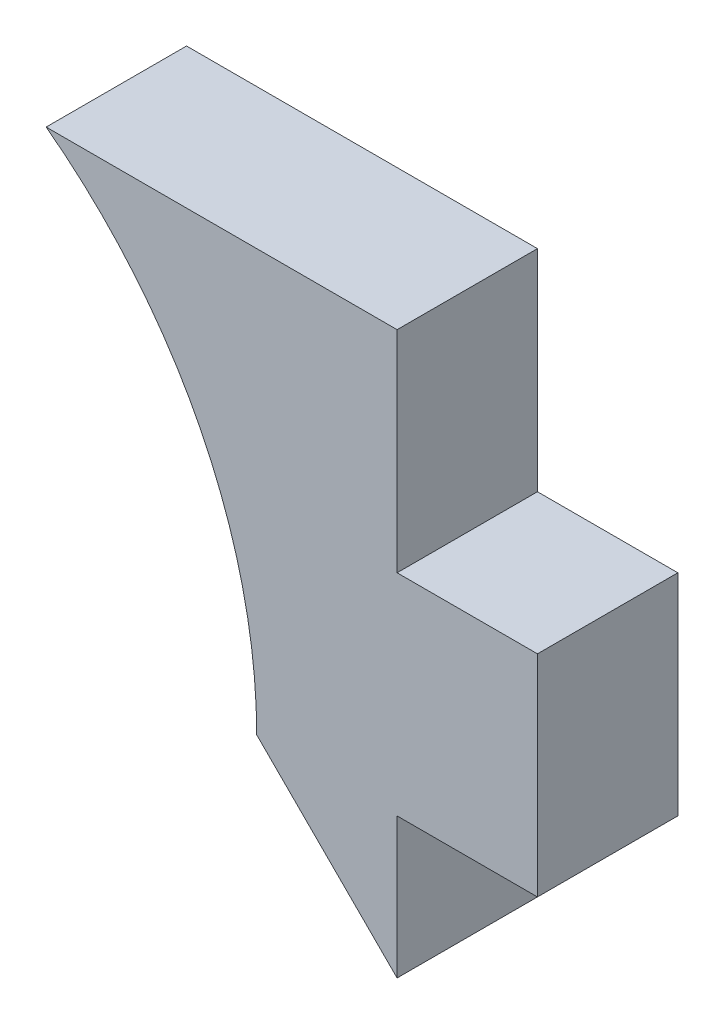
ISO-10303-21;
HEADER;
FILE_DESCRIPTION(('STEP AP214'),'2;1');
FILE_NAME('part.step','',(''),(''),'','','');
FILE_SCHEMA(('AUTOMOTIVE_DESIGN { 1 0 10303 214 1 1 1 1 }'));
ENDSEC;
DATA;
#1=APPLICATION_CONTEXT('core data for automotive mechanical design processes');
#2=APPLICATION_PROTOCOL_DEFINITION('international standard','automotive_design',2000,#1);
#3=PRODUCT_CONTEXT('',#1,'mechanical');
#4=PRODUCT('Part','Part','',(#3));
#5=PRODUCT_RELATED_PRODUCT_CATEGORY('part','',(#4));
#6=PRODUCT_DEFINITION_FORMATION('','',#4);
#7=PRODUCT_DEFINITION_CONTEXT('part definition',#1,'design');
#8=PRODUCT_DEFINITION('design','',#6,#7);
#9=PRODUCT_DEFINITION_SHAPE('','',#8);
#10=(LENGTH_UNIT() NAMED_UNIT(*) SI_UNIT(.MILLI.,.METRE.));
#11=(NAMED_UNIT(*) PLANE_ANGLE_UNIT() SI_UNIT($,.RADIAN.));
#12=(NAMED_UNIT(*) SI_UNIT($,.STERADIAN.) SOLID_ANGLE_UNIT());
#13=UNCERTAINTY_MEASURE_WITH_UNIT(LENGTH_MEASURE(1.E-05),#10,'distance_accuracy_value','');
#14=(GEOMETRIC_REPRESENTATION_CONTEXT(3) GLOBAL_UNCERTAINTY_ASSIGNED_CONTEXT((#13)) GLOBAL_UNIT_ASSIGNED_CONTEXT((#10,
#11,#12)) REPRESENTATION_CONTEXT('',''));
#15=CARTESIAN_POINT('',(0.,0.,0.));
#16=DIRECTION('',(0.,0.,1.));
#17=DIRECTION('',(1.,0.,0.));
#18=AXIS2_PLACEMENT_3D('',#15,#16,#17);
#19=CARTESIAN_POINT('',(497.,6.,3.));
#20=DIRECTION('',(0.,1.,0.));
#21=DIRECTION('',(0.,0.,1.));
#22=AXIS2_PLACEMENT_3D('',#19,#20,#21);
#23=PLANE('',#22);
#24=DIRECTION('',(1.,0.,0.));
#25=VECTOR('',#24,1.);
#26=CARTESIAN_POINT('',(497.,6.,0.));
#27=LINE('',#26,#25);
#28=CARTESIAN_POINT('',(494.,6.,0.));
#29=VERTEX_POINT('',#28);
#30=CARTESIAN_POINT('',(497.,6.,0.));
#31=VERTEX_POINT('',#30);
#32=EDGE_CURVE('E130',#29,#31,#27,.T.);
#33=ORIENTED_EDGE('',*,*,#32,.T.);
#34=DIRECTION('',(0.,0.,-1.));
#35=VECTOR('',#34,1.);
#36=CARTESIAN_POINT('',(497.,6.,3.));
#37=LINE('',#36,#35);
#38=CARTESIAN_POINT('',(497.,6.,3.));
#39=VERTEX_POINT('',#38);
#40=EDGE_CURVE('E11',#39,#31,#37,.T.);
#41=ORIENTED_EDGE('',*,*,#40,.F.);
#42=DIRECTION('',(1.,0.,0.));
#43=VECTOR('',#42,1.);
#44=CARTESIAN_POINT('',(497.,6.,3.));
#45=LINE('',#44,#43);
#46=CARTESIAN_POINT('',(494.,6.,3.));
#47=VERTEX_POINT('',#46);
#48=EDGE_CURVE('E144',#47,#39,#45,.T.);
#49=ORIENTED_EDGE('',*,*,#48,.F.);
#50=DIRECTION('',(0.,0.,-1.));
#51=VECTOR('',#50,1.);
#52=CARTESIAN_POINT('',(494.,6.,3.));
#53=LINE('',#52,#51);
#54=EDGE_CURVE('E126',#47,#29,#53,.T.);
#55=ORIENTED_EDGE('',*,*,#54,.T.);
#56=EDGE_LOOP('',(#33,#41,#49,#55));
#57=FACE_BOUND('',#56,.T.);
#58=ADVANCED_FACE('F34',(#57),#23,.F.);
#59=CARTESIAN_POINT('',(497.,10.5,3.));
#60=DIRECTION('',(-1.,0.,0.));
#61=DIRECTION('',(0.,0.,1.));
#62=AXIS2_PLACEMENT_3D('',#59,#60,#61);
#63=PLANE('',#62);
#64=DIRECTION('',(0.,1.,0.));
#65=VECTOR('',#64,1.);
#66=CARTESIAN_POINT('',(497.,10.5,0.));
#67=LINE('',#66,#65);
#68=CARTESIAN_POINT('',(497.,10.5,0.));
#69=VERTEX_POINT('',#68);
#70=EDGE_CURVE('E133',#31,#69,#67,.T.);
#71=ORIENTED_EDGE('',*,*,#70,.T.);
#72=DIRECTION('',(0.,0.,-1.));
#73=VECTOR('',#72,1.);
#74=CARTESIAN_POINT('',(497.,10.5,3.));
#75=LINE('',#74,#73);
#76=CARTESIAN_POINT('',(497.,10.5,3.));
#77=VERTEX_POINT('',#76);
#78=EDGE_CURVE('E42',#77,#69,#75,.T.);
#79=ORIENTED_EDGE('',*,*,#78,.F.);
#80=DIRECTION('',(0.,1.,0.));
#81=VECTOR('',#80,1.);
#82=CARTESIAN_POINT('',(497.,10.5,3.));
#83=LINE('',#82,#81);
#84=EDGE_CURVE('E93',#39,#77,#83,.T.);
#85=ORIENTED_EDGE('',*,*,#84,.F.);
#86=ORIENTED_EDGE('',*,*,#40,.T.);
#87=EDGE_LOOP('',(#71,#79,#85,#86));
#88=FACE_BOUND('',#87,.T.);
#89=ADVANCED_FACE('F179',(#88),#63,.F.);
#90=CARTESIAN_POINT('',(494.,10.5,3.));
#91=DIRECTION('',(0.,-1.,0.));
#92=DIRECTION('',(0.,0.,-1.));
#93=AXIS2_PLACEMENT_3D('',#90,#91,#92);
#94=PLANE('',#93);
#95=DIRECTION('',(-1.,0.,0.));
#96=VECTOR('',#95,1.);
#97=CARTESIAN_POINT('',(494.,10.5,0.));
#98=LINE('',#97,#96);
#99=CARTESIAN_POINT('',(494.,10.5,0.));
#100=VERTEX_POINT('',#99);
#101=EDGE_CURVE('E135',#69,#100,#98,.T.);
#102=ORIENTED_EDGE('',*,*,#101,.T.);
#103=DIRECTION('',(0.,0.,-1.));
#104=VECTOR('',#103,1.);
#105=CARTESIAN_POINT('',(494.,10.5,3.));
#106=LINE('',#105,#104);
#107=CARTESIAN_POINT('',(494.,10.5,3.));
#108=VERTEX_POINT('',#107);
#109=EDGE_CURVE('E151',#108,#100,#106,.T.);
#110=ORIENTED_EDGE('',*,*,#109,.F.);
#111=DIRECTION('',(-1.,0.,0.));
#112=VECTOR('',#111,1.);
#113=CARTESIAN_POINT('',(494.,10.5,3.));
#114=LINE('',#113,#112);
#115=EDGE_CURVE('E159',#77,#108,#114,.T.);
#116=ORIENTED_EDGE('',*,*,#115,.F.);
#117=ORIENTED_EDGE('',*,*,#78,.T.);
#118=EDGE_LOOP('',(#102,#110,#116,#117));
#119=FACE_BOUND('',#118,.T.);
#120=ADVANCED_FACE('F157',(#119),#94,.F.);
#121=CARTESIAN_POINT('',(494.,15.0000000000032,3.));
#122=DIRECTION('',(-1.,0.,0.));
#123=DIRECTION('',(0.,0.,1.));
#124=AXIS2_PLACEMENT_3D('',#121,#122,#123);
#125=PLANE('',#124);
#126=DIRECTION('',(0.,1.,0.));
#127=VECTOR('',#126,1.);
#128=CARTESIAN_POINT('',(494.,15.0000000000032,0.));
#129=LINE('',#128,#127);
#130=CARTESIAN_POINT('',(494.,15.0000000000032,0.));
#131=VERTEX_POINT('',#130);
#132=EDGE_CURVE('E137',#100,#131,#129,.T.);
#133=ORIENTED_EDGE('',*,*,#132,.T.);
#134=DIRECTION('',(0.,0.,-1.));
#135=VECTOR('',#134,1.);
#136=CARTESIAN_POINT('',(494.,15.0000000000032,3.));
#137=LINE('',#136,#135);
#138=CARTESIAN_POINT('',(494.,15.0000000000032,3.));
#139=VERTEX_POINT('',#138);
#140=EDGE_CURVE('E148',#139,#131,#137,.T.);
#141=ORIENTED_EDGE('',*,*,#140,.F.);
#142=DIRECTION('',(0.,1.,0.));
#143=VECTOR('',#142,1.);
#144=CARTESIAN_POINT('',(494.,15.0000000000032,3.));
#145=LINE('',#144,#143);
#146=EDGE_CURVE('E171',#108,#139,#145,.T.);
#147=ORIENTED_EDGE('',*,*,#146,.F.);
#148=ORIENTED_EDGE('',*,*,#109,.T.);
#149=EDGE_LOOP('',(#133,#141,#147,#148));
#150=FACE_BOUND('',#149,.T.);
#151=ADVANCED_FACE('F167',(#150),#125,.F.);
#152=CARTESIAN_POINT('',(486.499999999993,15.0000000000055,3.));
#153=DIRECTION('',(-3.02998367137008E-13,-1.,0.));
#154=DIRECTION('',(1.,-3.02998367137008E-13,0.));
#155=AXIS2_PLACEMENT_3D('',#152,#153,#154);
#156=PLANE('',#155);
#157=DIRECTION('',(-1.,3.02998367137008E-13,0.));
#158=VECTOR('',#157,1.);
#159=CARTESIAN_POINT('',(486.499999999993,15.0000000000055,0.));
#160=LINE('',#159,#158);
#161=CARTESIAN_POINT('',(486.499999999993,15.0000000000055,0.));
#162=VERTEX_POINT('',#161);
#163=EDGE_CURVE('E139',#131,#162,#160,.T.);
#164=ORIENTED_EDGE('',*,*,#163,.T.);
#165=DIRECTION('',(0.,0.,-1.));
#166=VECTOR('',#165,1.);
#167=CARTESIAN_POINT('',(486.499999999993,15.0000000000055,3.));
#168=LINE('',#167,#166);
#169=CARTESIAN_POINT('',(486.499999999993,15.0000000000055,3.));
#170=VERTEX_POINT('',#169);
#171=EDGE_CURVE('E121',#170,#162,#168,.T.);
#172=ORIENTED_EDGE('',*,*,#171,.F.);
#173=DIRECTION('',(-1.,3.02998367137008E-13,0.));
#174=VECTOR('',#173,1.);
#175=CARTESIAN_POINT('',(486.499999999993,15.0000000000055,3.));
#176=LINE('',#175,#174);
#177=EDGE_CURVE('E112',#139,#170,#176,.T.);
#178=ORIENTED_EDGE('',*,*,#177,.F.);
#179=ORIENTED_EDGE('',*,*,#140,.T.);
#180=EDGE_LOOP('',(#164,#172,#178,#179));
#181=FACE_BOUND('',#180,.T.);
#182=ADVANCED_FACE('F170',(#181),#156,.F.);
#183=CARTESIAN_POINT('',(479.75,6.00000000000034,3.));
#184=DIRECTION('',(0.,0.,-1.));
#185=DIRECTION('',(-1.,0.,0.));
#186=AXIS2_PLACEMENT_3D('',#183,#184,#185);
#187=CYLINDRICAL_SURFACE('',#186,11.2500000000001);
#188=CARTESIAN_POINT('',(479.75,6.00000000000034,0.));
#189=DIRECTION('',(0.,0.,-1.));
#190=DIRECTION('',(1.,0.,0.));
#191=AXIS2_PLACEMENT_3D('',#188,#189,#190);
#192=CIRCLE('',#191,11.2500000000001);
#193=CARTESIAN_POINT('',(491.,6.,0.));
#194=VERTEX_POINT('',#193);
#195=EDGE_CURVE('E120',#162,#194,#192,.T.);
#196=ORIENTED_EDGE('',*,*,#195,.T.);
#197=DIRECTION('',(0.,0.,-1.));
#198=VECTOR('',#197,1.);
#199=CARTESIAN_POINT('',(491.,6.,3.));
#200=LINE('',#199,#198);
#201=CARTESIAN_POINT('',(491.,6.,3.));
#202=VERTEX_POINT('',#201);
#203=EDGE_CURVE('E117',#202,#194,#200,.T.);
#204=ORIENTED_EDGE('',*,*,#203,.F.);
#205=CARTESIAN_POINT('',(479.75,6.00000000000034,3.));
#206=DIRECTION('',(0.,0.,-1.));
#207=DIRECTION('',(1.,0.,0.));
#208=AXIS2_PLACEMENT_3D('',#205,#206,#207);
#209=CIRCLE('',#208,11.2500000000001);
#210=EDGE_CURVE('E106',#170,#202,#209,.T.);
#211=ORIENTED_EDGE('',*,*,#210,.F.);
#212=ORIENTED_EDGE('',*,*,#171,.T.);
#213=EDGE_LOOP('',(#196,#204,#211,#212));
#214=FACE_BOUND('',#213,.T.);
#215=ADVANCED_FACE('F118',(#214),#187,.F.);
#216=CARTESIAN_POINT('',(494.,3.,3.));
#217=DIRECTION('',(0.707106781186547,0.707106781186548,0.));
#218=DIRECTION('',(-0.707106781186548,0.707106781186547,0.));
#219=AXIS2_PLACEMENT_3D('',#216,#217,#218);
#220=PLANE('',#219);
#221=DIRECTION('',(0.707106781186548,-0.707106781186547,0.));
#222=VECTOR('',#221,1.);
#223=CARTESIAN_POINT('',(494.,3.,0.));
#224=LINE('',#223,#222);
#225=CARTESIAN_POINT('',(494.,3.,0.));
#226=VERTEX_POINT('',#225);
#227=EDGE_CURVE('E79',#194,#226,#224,.T.);
#228=ORIENTED_EDGE('',*,*,#227,.T.);
#229=DIRECTION('',(0.,0.,-1.));
#230=VECTOR('',#229,1.);
#231=CARTESIAN_POINT('',(494.,3.,3.));
#232=LINE('',#231,#230);
#233=CARTESIAN_POINT('',(494.,3.,3.));
#234=VERTEX_POINT('',#233);
#235=EDGE_CURVE('E122',#234,#226,#232,.T.);
#236=ORIENTED_EDGE('',*,*,#235,.F.);
#237=DIRECTION('',(0.707106781186548,-0.707106781186547,0.));
#238=VECTOR('',#237,1.);
#239=CARTESIAN_POINT('',(494.,3.,3.));
#240=LINE('',#239,#238);
#241=EDGE_CURVE('E110',#202,#234,#240,.T.);
#242=ORIENTED_EDGE('',*,*,#241,.F.);
#243=ORIENTED_EDGE('',*,*,#203,.T.);
#244=EDGE_LOOP('',(#228,#236,#242,#243));
#245=FACE_BOUND('',#244,.T.);
#246=ADVANCED_FACE('F124',(#245),#220,.F.);
#247=CARTESIAN_POINT('',(494.,6.,3.));
#248=DIRECTION('',(-1.,0.,0.));
#249=DIRECTION('',(0.,0.,1.));
#250=AXIS2_PLACEMENT_3D('',#247,#248,#249);
#251=PLANE('',#250);
#252=DIRECTION('',(0.,1.,0.));
#253=VECTOR('',#252,1.);
#254=CARTESIAN_POINT('',(494.,6.,0.));
#255=LINE('',#254,#253);
#256=EDGE_CURVE('E85',#226,#29,#255,.T.);
#257=ORIENTED_EDGE('',*,*,#256,.T.);
#258=ORIENTED_EDGE('',*,*,#54,.F.);
#259=DIRECTION('',(0.,1.,0.));
#260=VECTOR('',#259,1.);
#261=CARTESIAN_POINT('',(494.,6.,3.));
#262=LINE('',#261,#260);
#263=EDGE_CURVE('E50',#234,#47,#262,.T.);
#264=ORIENTED_EDGE('',*,*,#263,.F.);
#265=ORIENTED_EDGE('',*,*,#235,.T.);
#266=EDGE_LOOP('',(#257,#258,#264,#265));
#267=FACE_BOUND('',#266,.T.);
#268=ADVANCED_FACE('F195',(#267),#251,.F.);
#269=CARTESIAN_POINT('',(479.75,6.00000000000034,3.));
#270=DIRECTION('',(0.,0.,1.));
#271=DIRECTION('',(1.,0.,0.));
#272=AXIS2_PLACEMENT_3D('',#269,#270,#271);
#273=PLANE('',#272);
#274=ORIENTED_EDGE('',*,*,#48,.T.);
#275=ORIENTED_EDGE('',*,*,#84,.T.);
#276=ORIENTED_EDGE('',*,*,#115,.T.);
#277=ORIENTED_EDGE('',*,*,#146,.T.);
#278=ORIENTED_EDGE('',*,*,#177,.T.);
#279=ORIENTED_EDGE('',*,*,#210,.T.);
#280=ORIENTED_EDGE('',*,*,#241,.T.);
#281=ORIENTED_EDGE('',*,*,#263,.T.);
#282=EDGE_LOOP('',(#274,#275,#276,#277,#278,#279,#280,#281));
#283=FACE_BOUND('',#282,.T.);
#284=ADVANCED_FACE('F108',(#283),#273,.T.);
#285=CARTESIAN_POINT('',(479.75,6.00000000000034,0.));
#286=DIRECTION('',(0.,0.,1.));
#287=DIRECTION('',(1.,0.,0.));
#288=AXIS2_PLACEMENT_3D('',#285,#286,#287);
#289=PLANE('',#288);
#290=ORIENTED_EDGE('',*,*,#32,.F.);
#291=ORIENTED_EDGE('',*,*,#256,.F.);
#292=ORIENTED_EDGE('',*,*,#227,.F.);
#293=ORIENTED_EDGE('',*,*,#195,.F.);
#294=ORIENTED_EDGE('',*,*,#163,.F.);
#295=ORIENTED_EDGE('',*,*,#132,.F.);
#296=ORIENTED_EDGE('',*,*,#101,.F.);
#297=ORIENTED_EDGE('',*,*,#70,.F.);
#298=EDGE_LOOP('',(#290,#291,#292,#293,#294,#295,#296,#297));
#299=FACE_BOUND('',#298,.T.);
#300=ADVANCED_FACE('F163',(#299),#289,.F.);
#301=CLOSED_SHELL('',(#58,#89,#120,#151,#182,#215,#246,#268,#284,#300));
#302=MANIFOLD_SOLID_BREP('B2',#301);
#303=ADVANCED_BREP_SHAPE_REPRESENTATION('',(#18,#302),#14);
#304=SHAPE_DEFINITION_REPRESENTATION(#9,#303);
ENDSEC;
END-ISO-10303-21;
